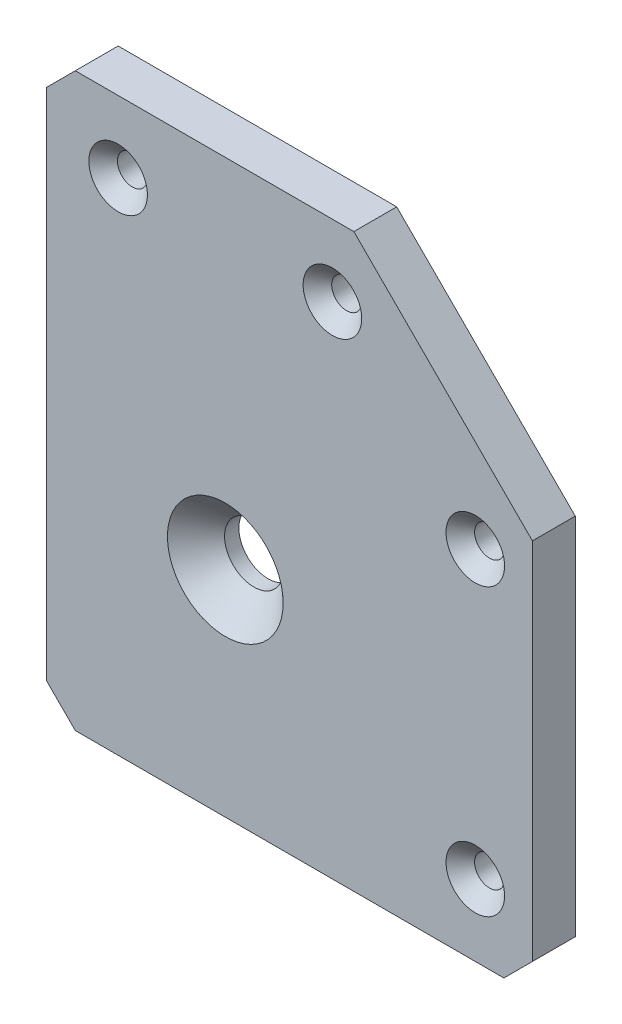
ISO-10303-21;
HEADER;
FILE_DESCRIPTION(('STEP AP214'),'2;1');
FILE_NAME('part.step','',(''),(''),'','','');
FILE_SCHEMA(('AUTOMOTIVE_DESIGN { 1 0 10303 214 1 1 1 1 }'));
ENDSEC;
DATA;
#1=APPLICATION_CONTEXT('core data for automotive mechanical design processes');
#2=APPLICATION_PROTOCOL_DEFINITION('international standard','automotive_design',2000,#1);
#3=PRODUCT_CONTEXT('',#1,'mechanical');
#4=PRODUCT('Part','Part','',(#3));
#5=PRODUCT_RELATED_PRODUCT_CATEGORY('part','',(#4));
#6=PRODUCT_DEFINITION_FORMATION('','',#4);
#7=PRODUCT_DEFINITION_CONTEXT('part definition',#1,'design');
#8=PRODUCT_DEFINITION('design','',#6,#7);
#9=PRODUCT_DEFINITION_SHAPE('','',#8);
#10=(LENGTH_UNIT() NAMED_UNIT(*) SI_UNIT(.MILLI.,.METRE.));
#11=(NAMED_UNIT(*) PLANE_ANGLE_UNIT() SI_UNIT($,.RADIAN.));
#12=(NAMED_UNIT(*) SI_UNIT($,.STERADIAN.) SOLID_ANGLE_UNIT());
#13=UNCERTAINTY_MEASURE_WITH_UNIT(LENGTH_MEASURE(1.E-05),#10,'distance_accuracy_value','');
#14=(GEOMETRIC_REPRESENTATION_CONTEXT(3) GLOBAL_UNCERTAINTY_ASSIGNED_CONTEXT((#13)) GLOBAL_UNIT_ASSIGNED_CONTEXT((#10,
#11,#12)) REPRESENTATION_CONTEXT('',''));
#15=CARTESIAN_POINT('',(0.,0.,0.));
#16=DIRECTION('',(0.,0.,1.));
#17=DIRECTION('',(1.,0.,0.));
#18=AXIS2_PLACEMENT_3D('',#15,#16,#17);
#19=CARTESIAN_POINT('',(0.,0.,3.));
#20=DIRECTION('',(0.,0.,1.));
#21=DIRECTION('',(1.,0.,0.));
#22=AXIS2_PLACEMENT_3D('',#19,#20,#21);
#23=PLANE('',#22);
#24=CARTESIAN_POINT('',(35.,-20.,3.));
#25=DIRECTION('',(0.,0.,1.));
#26=DIRECTION('',(1.,0.,0.));
#27=AXIS2_PLACEMENT_3D('',#24,#25,#26);
#28=CIRCLE('',#27,4.10000000000001);
#29=CARTESIAN_POINT('',(39.1,-20.,3.));
#30=VERTEX_POINT('',#29);
#31=EDGE_CURVE('E182',#30,#30,#28,.F.);
#32=ORIENTED_EDGE('',*,*,#31,.T.);
#33=EDGE_LOOP('',(#32));
#34=FACE_BOUND('',#33,.T.);
#35=CARTESIAN_POINT('',(35.,20.,3.));
#36=DIRECTION('',(0.,0.,1.));
#37=DIRECTION('',(1.,0.,0.));
#38=AXIS2_PLACEMENT_3D('',#35,#36,#37);
#39=CIRCLE('',#38,4.10000000000001);
#40=CARTESIAN_POINT('',(39.1,20.,3.));
#41=VERTEX_POINT('',#40);
#42=EDGE_CURVE('E179',#41,#41,#39,.F.);
#43=ORIENTED_EDGE('',*,*,#42,.T.);
#44=EDGE_LOOP('',(#43));
#45=FACE_BOUND('',#44,.T.);
#46=CARTESIAN_POINT('',(-15.,40.,3.));
#47=DIRECTION('',(0.,0.,1.));
#48=DIRECTION('',(1.,0.,0.));
#49=AXIS2_PLACEMENT_3D('',#46,#47,#48);
#50=CIRCLE('',#49,4.10000000000002);
#51=CARTESIAN_POINT('',(-10.9,40.,3.));
#52=VERTEX_POINT('',#51);
#53=EDGE_CURVE('E176',#52,#52,#50,.F.);
#54=ORIENTED_EDGE('',*,*,#53,.T.);
#55=EDGE_LOOP('',(#54));
#56=FACE_BOUND('',#55,.T.);
#57=CARTESIAN_POINT('',(15.,40.,3.));
#58=DIRECTION('',(0.,0.,1.));
#59=DIRECTION('',(1.,0.,0.));
#60=AXIS2_PLACEMENT_3D('',#57,#58,#59);
#61=CIRCLE('',#60,4.1);
#62=CARTESIAN_POINT('',(19.1,40.,3.));
#63=VERTEX_POINT('',#62);
#64=EDGE_CURVE('E173',#63,#63,#61,.F.);
#65=ORIENTED_EDGE('',*,*,#64,.T.);
#66=EDGE_LOOP('',(#65));
#67=FACE_BOUND('',#66,.T.);
#68=CARTESIAN_POINT('',(0.,0.,3.));
#69=DIRECTION('',(0.,0.,1.));
#70=DIRECTION('',(1.,0.,0.));
#71=AXIS2_PLACEMENT_3D('',#68,#69,#70);
#72=CIRCLE('',#71,8.1);
#73=CARTESIAN_POINT('',(8.1,0.,3.));
#74=VERTEX_POINT('',#73);
#75=EDGE_CURVE('E150',#74,#74,#72,.F.);
#76=ORIENTED_EDGE('',*,*,#75,.T.);
#77=EDGE_LOOP('',(#76));
#78=FACE_BOUND('',#77,.T.);
#79=DIRECTION('',(-1.,0.,0.));
#80=VECTOR('',#79,1.);
#81=CARTESIAN_POINT('',(43.,50.,3.));
#82=LINE('',#81,#80);
#83=CARTESIAN_POINT('',(18.,50.,3.));
#84=VERTEX_POINT('',#83);
#85=CARTESIAN_POINT('',(-21.,50.,3.));
#86=VERTEX_POINT('',#85);
#87=EDGE_CURVE('E122',#84,#86,#82,.T.);
#88=ORIENTED_EDGE('',*,*,#87,.T.);
#89=DIRECTION('',(0.707106781186547,0.707106781186548,0.));
#90=VECTOR('',#89,1.);
#91=CARTESIAN_POINT('',(-35.5,35.5,3.));
#92=LINE('',#91,#90);
#93=CARTESIAN_POINT('',(-25.,46.,3.));
#94=VERTEX_POINT('',#93);
#95=EDGE_CURVE('E148',#86,#94,#92,.F.);
#96=ORIENTED_EDGE('',*,*,#95,.T.);
#97=DIRECTION('',(0.,-1.,0.));
#98=VECTOR('',#97,1.);
#99=CARTESIAN_POINT('',(-25.,-30.,3.));
#100=LINE('',#99,#98);
#101=CARTESIAN_POINT('',(-25.,-26.,3.));
#102=VERTEX_POINT('',#101);
#103=EDGE_CURVE('E128',#94,#102,#100,.T.);
#104=ORIENTED_EDGE('',*,*,#103,.T.);
#105=DIRECTION('',(-0.707106781186546,0.707106781186549,0.));
#106=VECTOR('',#105,1.);
#107=CARTESIAN_POINT('',(-25.5000000000001,-25.5,3.));
#108=LINE('',#107,#106);
#109=CARTESIAN_POINT('',(-21.,-30.,3.));
#110=VERTEX_POINT('',#109);
#111=EDGE_CURVE('E144',#102,#110,#108,.F.);
#112=ORIENTED_EDGE('',*,*,#111,.T.);
#113=DIRECTION('',(1.,0.,0.));
#114=VECTOR('',#113,1.);
#115=CARTESIAN_POINT('',(43.,-30.,3.));
#116=LINE('',#115,#114);
#117=CARTESIAN_POINT('',(39.,-30.,3.));
#118=VERTEX_POINT('',#117);
#119=EDGE_CURVE('E132',#110,#118,#116,.T.);
#120=ORIENTED_EDGE('',*,*,#119,.T.);
#121=DIRECTION('',(-0.70710678118655,-0.707106781186545,0.));
#122=VECTOR('',#121,1.);
#123=CARTESIAN_POINT('',(34.4999999999999,-34.5000000000001,3.));
#124=LINE('',#123,#122);
#125=CARTESIAN_POINT('',(43.,-26.,3.));
#126=VERTEX_POINT('',#125);
#127=EDGE_CURVE('E146',#118,#126,#124,.F.);
#128=ORIENTED_EDGE('',*,*,#127,.T.);
#129=DIRECTION('',(0.,1.,0.));
#130=VECTOR('',#129,1.);
#131=CARTESIAN_POINT('',(43.,-30.,3.));
#132=LINE('',#131,#130);
#133=CARTESIAN_POINT('',(43.,24.9999999999999,3.));
#134=VERTEX_POINT('',#133);
#135=EDGE_CURVE('E309',#126,#134,#132,.T.);
#136=ORIENTED_EDGE('',*,*,#135,.T.);
#137=DIRECTION('',(0.707106781186547,-0.707106781186548,0.));
#138=VECTOR('',#137,1.);
#139=CARTESIAN_POINT('',(34.,33.9999999999999,3.));
#140=LINE('',#139,#138);
#141=EDGE_CURVE('E139',#134,#84,#140,.F.);
#142=ORIENTED_EDGE('',*,*,#141,.T.);
#143=EDGE_LOOP('',(#88,#96,#104,#112,#120,#128,#136,#142));
#144=FACE_BOUND('',#143,.T.);
#145=ADVANCED_FACE('F37',(#34,#45,#56,#67,#78,#144),#23,.T.);
#146=CARTESIAN_POINT('',(0.,0.,-3.));
#147=DIRECTION('',(0.,0.,1.));
#148=DIRECTION('',(1.,0.,0.));
#149=AXIS2_PLACEMENT_3D('',#146,#147,#148);
#150=PLANE('',#149);
#151=DIRECTION('',(0.,-1.,0.));
#152=VECTOR('',#151,1.);
#153=CARTESIAN_POINT('',(-25.,-30.,-3.));
#154=LINE('',#153,#152);
#155=CARTESIAN_POINT('',(-25.,46.,-3.));
#156=VERTEX_POINT('',#155);
#157=CARTESIAN_POINT('',(-25.,-26.,-3.));
#158=VERTEX_POINT('',#157);
#159=EDGE_CURVE('E305',#156,#158,#154,.T.);
#160=ORIENTED_EDGE('',*,*,#159,.F.);
#161=DIRECTION('',(-0.707106781186547,-0.707106781186548,0.));
#162=VECTOR('',#161,1.);
#163=CARTESIAN_POINT('',(-25.,46.,-3.));
#164=LINE('',#163,#162);
#165=CARTESIAN_POINT('',(-21.,50.,-3.));
#166=VERTEX_POINT('',#165);
#167=EDGE_CURVE('E127',#156,#166,#164,.F.);
#168=ORIENTED_EDGE('',*,*,#167,.T.);
#169=DIRECTION('',(-1.,0.,0.));
#170=VECTOR('',#169,1.);
#171=CARTESIAN_POINT('',(43.,50.,-3.));
#172=LINE('',#171,#170);
#173=CARTESIAN_POINT('',(18.,50.,-3.));
#174=VERTEX_POINT('',#173);
#175=EDGE_CURVE('E119',#174,#166,#172,.T.);
#176=ORIENTED_EDGE('',*,*,#175,.F.);
#177=DIRECTION('',(-0.707106781186547,0.707106781186548,0.));
#178=VECTOR('',#177,1.);
#179=CARTESIAN_POINT('',(18.,50.,-3.));
#180=LINE('',#179,#178);
#181=CARTESIAN_POINT('',(43.,24.9999999999999,-3.));
#182=VERTEX_POINT('',#181);
#183=EDGE_CURVE('E106',#174,#182,#180,.F.);
#184=ORIENTED_EDGE('',*,*,#183,.T.);
#185=DIRECTION('',(0.,1.,0.));
#186=VECTOR('',#185,1.);
#187=CARTESIAN_POINT('',(43.,-30.,-3.));
#188=LINE('',#187,#186);
#189=CARTESIAN_POINT('',(43.,-26.,-3.));
#190=VERTEX_POINT('',#189);
#191=EDGE_CURVE('E129',#190,#182,#188,.T.);
#192=ORIENTED_EDGE('',*,*,#191,.F.);
#193=DIRECTION('',(0.70710678118655,0.707106781186545,0.));
#194=VECTOR('',#193,1.);
#195=CARTESIAN_POINT('',(43.,-26.,-3.));
#196=LINE('',#195,#194);
#197=CARTESIAN_POINT('',(39.,-30.,-3.));
#198=VERTEX_POINT('',#197);
#199=EDGE_CURVE('E53',#190,#198,#196,.F.);
#200=ORIENTED_EDGE('',*,*,#199,.T.);
#201=DIRECTION('',(1.,0.,0.));
#202=VECTOR('',#201,1.);
#203=CARTESIAN_POINT('',(43.,-30.,-3.));
#204=LINE('',#203,#202);
#205=CARTESIAN_POINT('',(-21.,-30.,-3.));
#206=VERTEX_POINT('',#205);
#207=EDGE_CURVE('E134',#206,#198,#204,.T.);
#208=ORIENTED_EDGE('',*,*,#207,.F.);
#209=DIRECTION('',(0.707106781186546,-0.707106781186549,0.));
#210=VECTOR('',#209,1.);
#211=CARTESIAN_POINT('',(-21.,-30.,-3.));
#212=LINE('',#211,#210);
#213=EDGE_CURVE('E61',#206,#158,#212,.F.);
#214=ORIENTED_EDGE('',*,*,#213,.T.);
#215=EDGE_LOOP('',(#160,#168,#176,#184,#192,#200,#208,#214));
#216=FACE_BOUND('',#215,.T.);
#217=CARTESIAN_POINT('',(0.,0.,-3.));
#218=DIRECTION('',(0.,0.,1.));
#219=DIRECTION('',(1.,0.,0.));
#220=AXIS2_PLACEMENT_3D('',#217,#218,#219);
#221=CIRCLE('',#220,4.1);
#222=CARTESIAN_POINT('',(4.1,0.,-3.));
#223=VERTEX_POINT('',#222);
#224=EDGE_CURVE('E297',#223,#223,#221,.T.);
#225=ORIENTED_EDGE('',*,*,#224,.T.);
#226=EDGE_LOOP('',(#225));
#227=FACE_BOUND('',#226,.T.);
#228=CARTESIAN_POINT('',(35.,20.,-3.));
#229=DIRECTION('',(0.,0.,1.));
#230=DIRECTION('',(1.,0.,0.));
#231=AXIS2_PLACEMENT_3D('',#228,#229,#230);
#232=CIRCLE('',#231,2.1);
#233=CARTESIAN_POINT('',(37.1,20.,-3.));
#234=VERTEX_POINT('',#233);
#235=EDGE_CURVE('E293',#234,#234,#232,.T.);
#236=ORIENTED_EDGE('',*,*,#235,.T.);
#237=EDGE_LOOP('',(#236));
#238=FACE_BOUND('',#237,.T.);
#239=CARTESIAN_POINT('',(35.,-20.,-3.));
#240=DIRECTION('',(0.,0.,1.));
#241=DIRECTION('',(1.,0.,0.));
#242=AXIS2_PLACEMENT_3D('',#239,#240,#241);
#243=CIRCLE('',#242,2.1);
#244=CARTESIAN_POINT('',(37.1,-20.,-3.));
#245=VERTEX_POINT('',#244);
#246=EDGE_CURVE('E291',#245,#245,#243,.T.);
#247=ORIENTED_EDGE('',*,*,#246,.T.);
#248=EDGE_LOOP('',(#247));
#249=FACE_BOUND('',#248,.T.);
#250=CARTESIAN_POINT('',(-15.,40.,-3.));
#251=DIRECTION('',(0.,0.,1.));
#252=DIRECTION('',(1.,0.,0.));
#253=AXIS2_PLACEMENT_3D('',#250,#251,#252);
#254=CIRCLE('',#253,2.1);
#255=CARTESIAN_POINT('',(-12.9,40.,-3.));
#256=VERTEX_POINT('',#255);
#257=EDGE_CURVE('E294',#256,#256,#254,.T.);
#258=ORIENTED_EDGE('',*,*,#257,.T.);
#259=EDGE_LOOP('',(#258));
#260=FACE_BOUND('',#259,.T.);
#261=CARTESIAN_POINT('',(15.,40.,-3.));
#262=DIRECTION('',(0.,0.,1.));
#263=DIRECTION('',(1.,0.,0.));
#264=AXIS2_PLACEMENT_3D('',#261,#262,#263);
#265=CIRCLE('',#264,2.1);
#266=CARTESIAN_POINT('',(17.1,40.,-3.));
#267=VERTEX_POINT('',#266);
#268=EDGE_CURVE('E300',#267,#267,#265,.T.);
#269=ORIENTED_EDGE('',*,*,#268,.T.);
#270=EDGE_LOOP('',(#269));
#271=FACE_BOUND('',#270,.T.);
#272=ADVANCED_FACE('F125',(#216,#227,#238,#249,#260,#271),#150,.F.);
#273=CARTESIAN_POINT('',(-25.,-30.,3.));
#274=DIRECTION('',(1.,0.,0.));
#275=DIRECTION('',(0.,1.,0.));
#276=AXIS2_PLACEMENT_3D('',#273,#274,#275);
#277=PLANE('',#276);
#278=ORIENTED_EDGE('',*,*,#103,.F.);
#279=DIRECTION('',(0.,0.,-1.));
#280=VECTOR('',#279,1.);
#281=CARTESIAN_POINT('',(-25.,46.,3.));
#282=LINE('',#281,#280);
#283=EDGE_CURVE('E155',#94,#156,#282,.T.);
#284=ORIENTED_EDGE('',*,*,#283,.T.);
#285=ORIENTED_EDGE('',*,*,#159,.T.);
#286=DIRECTION('',(0.,0.,1.));
#287=VECTOR('',#286,1.);
#288=CARTESIAN_POINT('',(-25.,-26.,3.));
#289=LINE('',#288,#287);
#290=EDGE_CURVE('E153',#158,#102,#289,.T.);
#291=ORIENTED_EDGE('',*,*,#290,.T.);
#292=EDGE_LOOP('',(#278,#284,#285,#291));
#293=FACE_BOUND('',#292,.T.);
#294=ADVANCED_FACE('F213',(#293),#277,.F.);
#295=CARTESIAN_POINT('',(43.,-30.,3.));
#296=DIRECTION('',(0.,1.,0.));
#297=DIRECTION('',(-1.,0.,0.));
#298=AXIS2_PLACEMENT_3D('',#295,#296,#297);
#299=PLANE('',#298);
#300=ORIENTED_EDGE('',*,*,#207,.T.);
#301=DIRECTION('',(0.,0.,1.));
#302=VECTOR('',#301,1.);
#303=CARTESIAN_POINT('',(39.,-30.,3.));
#304=LINE('',#303,#302);
#305=EDGE_CURVE('E168',#198,#118,#304,.T.);
#306=ORIENTED_EDGE('',*,*,#305,.T.);
#307=ORIENTED_EDGE('',*,*,#119,.F.);
#308=DIRECTION('',(0.,0.,-1.));
#309=VECTOR('',#308,1.);
#310=CARTESIAN_POINT('',(-21.,-30.,3.));
#311=LINE('',#310,#309);
#312=EDGE_CURVE('E166',#110,#206,#311,.T.);
#313=ORIENTED_EDGE('',*,*,#312,.T.);
#314=EDGE_LOOP('',(#300,#306,#307,#313));
#315=FACE_BOUND('',#314,.T.);
#316=ADVANCED_FACE('F225',(#315),#299,.F.);
#317=CARTESIAN_POINT('',(43.,-30.,3.));
#318=DIRECTION('',(-1.,0.,0.));
#319=DIRECTION('',(0.,-1.,0.));
#320=AXIS2_PLACEMENT_3D('',#317,#318,#319);
#321=PLANE('',#320);
#322=ORIENTED_EDGE('',*,*,#135,.F.);
#323=DIRECTION('',(0.,0.,-1.));
#324=VECTOR('',#323,1.);
#325=CARTESIAN_POINT('',(43.,-26.,3.));
#326=LINE('',#325,#324);
#327=EDGE_CURVE('E163',#126,#190,#326,.T.);
#328=ORIENTED_EDGE('',*,*,#327,.T.);
#329=ORIENTED_EDGE('',*,*,#191,.T.);
#330=DIRECTION('',(0.,0.,1.));
#331=VECTOR('',#330,1.);
#332=CARTESIAN_POINT('',(43.,24.9999999999999,3.));
#333=LINE('',#332,#331);
#334=EDGE_CURVE('E112',#182,#134,#333,.T.);
#335=ORIENTED_EDGE('',*,*,#334,.T.);
#336=EDGE_LOOP('',(#322,#328,#329,#335));
#337=FACE_BOUND('',#336,.T.);
#338=ADVANCED_FACE('F222',(#337),#321,.F.);
#339=CARTESIAN_POINT('',(43.,50.,3.));
#340=DIRECTION('',(0.,-1.,0.));
#341=DIRECTION('',(1.,0.,0.));
#342=AXIS2_PLACEMENT_3D('',#339,#340,#341);
#343=PLANE('',#342);
#344=ORIENTED_EDGE('',*,*,#175,.T.);
#345=DIRECTION('',(0.,0.,1.));
#346=VECTOR('',#345,1.);
#347=CARTESIAN_POINT('',(-21.,50.,3.));
#348=LINE('',#347,#346);
#349=EDGE_CURVE('E161',#166,#86,#348,.T.);
#350=ORIENTED_EDGE('',*,*,#349,.T.);
#351=ORIENTED_EDGE('',*,*,#87,.F.);
#352=DIRECTION('',(0.,0.,-1.));
#353=VECTOR('',#352,1.);
#354=CARTESIAN_POINT('',(18.,50.,3.));
#355=LINE('',#354,#353);
#356=EDGE_CURVE('E110',#84,#174,#355,.T.);
#357=ORIENTED_EDGE('',*,*,#356,.T.);
#358=EDGE_LOOP('',(#344,#350,#351,#357));
#359=FACE_BOUND('',#358,.T.);
#360=ADVANCED_FACE('F118',(#359),#343,.F.);
#361=CARTESIAN_POINT('',(0.,0.,3.));
#362=DIRECTION('',(0.,0.,-1.));
#363=DIRECTION('',(-1.,0.,0.));
#364=AXIS2_PLACEMENT_3D('',#361,#362,#363);
#365=CYLINDRICAL_SURFACE('',#364,4.1);
#366=CARTESIAN_POINT('',(0.,0.,-0.999999999999997));
#367=DIRECTION('',(0.,0.,1.));
#368=DIRECTION('',(1.,0.,0.));
#369=AXIS2_PLACEMENT_3D('',#366,#367,#368);
#370=CIRCLE('',#369,4.1);
#371=CARTESIAN_POINT('',(4.1,0.,-0.999999999999997));
#372=VERTEX_POINT('',#371);
#373=EDGE_CURVE('E141',#372,#372,#370,.T.);
#374=ORIENTED_EDGE('',*,*,#373,.T.);
#375=EDGE_LOOP('',(#374));
#376=FACE_BOUND('',#375,.T.);
#377=ORIENTED_EDGE('',*,*,#224,.F.);
#378=EDGE_LOOP('',(#377));
#379=FACE_BOUND('',#378,.T.);
#380=ADVANCED_FACE('F217',(#376,#379),#365,.F.);
#381=CARTESIAN_POINT('',(35.,20.,3.));
#382=DIRECTION('',(0.,0.,-1.));
#383=DIRECTION('',(-1.,0.,0.));
#384=AXIS2_PLACEMENT_3D('',#381,#382,#383);
#385=CYLINDRICAL_SURFACE('',#384,2.1);
#386=CARTESIAN_POINT('',(35.,20.,0.999999999999998));
#387=DIRECTION('',(0.,0.,1.));
#388=DIRECTION('',(1.,0.,0.));
#389=AXIS2_PLACEMENT_3D('',#386,#387,#388);
#390=CIRCLE('',#389,2.1);
#391=CARTESIAN_POINT('',(37.1,20.,0.999999999999998));
#392=VERTEX_POINT('',#391);
#393=EDGE_CURVE('E185',#392,#392,#390,.T.);
#394=ORIENTED_EDGE('',*,*,#393,.T.);
#395=EDGE_LOOP('',(#394));
#396=FACE_BOUND('',#395,.T.);
#397=ORIENTED_EDGE('',*,*,#235,.F.);
#398=EDGE_LOOP('',(#397));
#399=FACE_BOUND('',#398,.T.);
#400=ADVANCED_FACE('F287',(#396,#399),#385,.F.);
#401=CARTESIAN_POINT('',(35.,-20.,3.));
#402=DIRECTION('',(0.,0.,-1.));
#403=DIRECTION('',(-1.,0.,0.));
#404=AXIS2_PLACEMENT_3D('',#401,#402,#403);
#405=CYLINDRICAL_SURFACE('',#404,2.1);
#406=CARTESIAN_POINT('',(35.,-20.,0.999999999999998));
#407=DIRECTION('',(0.,0.,1.));
#408=DIRECTION('',(1.,0.,0.));
#409=AXIS2_PLACEMENT_3D('',#406,#407,#408);
#410=CIRCLE('',#409,2.1);
#411=CARTESIAN_POINT('',(37.1,-20.,0.999999999999998));
#412=VERTEX_POINT('',#411);
#413=EDGE_CURVE('E170',#412,#412,#410,.T.);
#414=ORIENTED_EDGE('',*,*,#413,.T.);
#415=EDGE_LOOP('',(#414));
#416=FACE_BOUND('',#415,.T.);
#417=ORIENTED_EDGE('',*,*,#246,.F.);
#418=EDGE_LOOP('',(#417));
#419=FACE_BOUND('',#418,.T.);
#420=ADVANCED_FACE('F284',(#416,#419),#405,.F.);
#421=CARTESIAN_POINT('',(-15.,40.,3.));
#422=DIRECTION('',(0.,0.,-1.));
#423=DIRECTION('',(-1.,0.,0.));
#424=AXIS2_PLACEMENT_3D('',#421,#422,#423);
#425=CYLINDRICAL_SURFACE('',#424,2.1);
#426=CARTESIAN_POINT('',(-15.,40.,0.999999999999969));
#427=DIRECTION('',(0.,0.,1.));
#428=DIRECTION('',(1.,0.,0.));
#429=AXIS2_PLACEMENT_3D('',#426,#427,#428);
#430=CIRCLE('',#429,2.1);
#431=CARTESIAN_POINT('',(-12.9,40.,0.999999999999969));
#432=VERTEX_POINT('',#431);
#433=EDGE_CURVE('E46',#432,#432,#430,.T.);
#434=ORIENTED_EDGE('',*,*,#433,.T.);
#435=EDGE_LOOP('',(#434));
#436=FACE_BOUND('',#435,.T.);
#437=ORIENTED_EDGE('',*,*,#257,.F.);
#438=EDGE_LOOP('',(#437));
#439=FACE_BOUND('',#438,.T.);
#440=ADVANCED_FACE('F190',(#436,#439),#425,.F.);
#441=CARTESIAN_POINT('',(15.,40.,3.));
#442=DIRECTION('',(0.,0.,-1.));
#443=DIRECTION('',(-1.,0.,0.));
#444=AXIS2_PLACEMENT_3D('',#441,#442,#443);
#445=CYLINDRICAL_SURFACE('',#444,2.1);
#446=CARTESIAN_POINT('',(15.,40.,0.999999999999998));
#447=DIRECTION('',(0.,0.,1.));
#448=DIRECTION('',(1.,0.,0.));
#449=AXIS2_PLACEMENT_3D('',#446,#447,#448);
#450=CIRCLE('',#449,2.1);
#451=CARTESIAN_POINT('',(17.1,40.,0.999999999999998));
#452=VERTEX_POINT('',#451);
#453=EDGE_CURVE('E11',#452,#452,#450,.T.);
#454=ORIENTED_EDGE('',*,*,#453,.T.);
#455=EDGE_LOOP('',(#454));
#456=FACE_BOUND('',#455,.T.);
#457=ORIENTED_EDGE('',*,*,#268,.F.);
#458=EDGE_LOOP('',(#457));
#459=FACE_BOUND('',#458,.T.);
#460=ADVANCED_FACE('F240',(#456,#459),#445,.F.);
#461=CARTESIAN_POINT('',(18.,50.,3.));
#462=DIRECTION('',(-0.707106781186548,-0.707106781186547,0.));
#463=DIRECTION('',(0.,0.,-1.));
#464=AXIS2_PLACEMENT_3D('',#461,#462,#463);
#465=PLANE('',#464);
#466=ORIENTED_EDGE('',*,*,#141,.F.);
#467=ORIENTED_EDGE('',*,*,#334,.F.);
#468=ORIENTED_EDGE('',*,*,#183,.F.);
#469=ORIENTED_EDGE('',*,*,#356,.F.);
#470=EDGE_LOOP('',(#466,#467,#468,#469));
#471=FACE_BOUND('',#470,.T.);
#472=ADVANCED_FACE('F109',(#471),#465,.F.);
#473=CARTESIAN_POINT('',(0.,0.,-0.999999999999997));
#474=DIRECTION('',(0.,0.,1.));
#475=DIRECTION('',(1.,0.,0.));
#476=AXIS2_PLACEMENT_3D('',#473,#474,#475);
#477=CONICAL_SURFACE('',#476,4.1,0.785398163397448);
#478=ORIENTED_EDGE('',*,*,#75,.F.);
#479=EDGE_LOOP('',(#478));
#480=FACE_BOUND('',#479,.T.);
#481=ORIENTED_EDGE('',*,*,#373,.F.);
#482=EDGE_LOOP('',(#481));
#483=FACE_BOUND('',#482,.T.);
#484=ADVANCED_FACE('F239',(#480,#483),#477,.F.);
#485=CARTESIAN_POINT('',(-25.,46.,3.));
#486=DIRECTION('',(0.707106781186548,-0.707106781186547,0.));
#487=DIRECTION('',(0.,0.,-1.));
#488=AXIS2_PLACEMENT_3D('',#485,#486,#487);
#489=PLANE('',#488);
#490=ORIENTED_EDGE('',*,*,#95,.F.);
#491=ORIENTED_EDGE('',*,*,#349,.F.);
#492=ORIENTED_EDGE('',*,*,#167,.F.);
#493=ORIENTED_EDGE('',*,*,#283,.F.);
#494=EDGE_LOOP('',(#490,#491,#492,#493));
#495=FACE_BOUND('',#494,.T.);
#496=ADVANCED_FACE('F246',(#495),#489,.F.);
#497=CARTESIAN_POINT('',(43.,-26.,3.));
#498=DIRECTION('',(-0.707106781186545,0.70710678118655,0.));
#499=DIRECTION('',(0.,0.,-1.));
#500=AXIS2_PLACEMENT_3D('',#497,#498,#499);
#501=PLANE('',#500);
#502=ORIENTED_EDGE('',*,*,#127,.F.);
#503=ORIENTED_EDGE('',*,*,#305,.F.);
#504=ORIENTED_EDGE('',*,*,#199,.F.);
#505=ORIENTED_EDGE('',*,*,#327,.F.);
#506=EDGE_LOOP('',(#502,#503,#504,#505));
#507=FACE_BOUND('',#506,.T.);
#508=ADVANCED_FACE('F253',(#507),#501,.F.);
#509=CARTESIAN_POINT('',(-21.,-30.,3.));
#510=DIRECTION('',(0.707106781186549,0.707106781186546,0.));
#511=DIRECTION('',(0.,0.,-1.));
#512=AXIS2_PLACEMENT_3D('',#509,#510,#511);
#513=PLANE('',#512);
#514=ORIENTED_EDGE('',*,*,#111,.F.);
#515=ORIENTED_EDGE('',*,*,#290,.F.);
#516=ORIENTED_EDGE('',*,*,#213,.F.);
#517=ORIENTED_EDGE('',*,*,#312,.F.);
#518=EDGE_LOOP('',(#514,#515,#516,#517));
#519=FACE_BOUND('',#518,.T.);
#520=ADVANCED_FACE('F260',(#519),#513,.F.);
#521=CARTESIAN_POINT('',(35.,-20.,0.999999999999998));
#522=DIRECTION('',(0.,0.,1.));
#523=DIRECTION('',(1.,0.,0.));
#524=AXIS2_PLACEMENT_3D('',#521,#522,#523);
#525=CONICAL_SURFACE('',#524,2.1,0.78539816339745);
#526=ORIENTED_EDGE('',*,*,#31,.F.);
#527=EDGE_LOOP('',(#526));
#528=FACE_BOUND('',#527,.T.);
#529=ORIENTED_EDGE('',*,*,#413,.F.);
#530=EDGE_LOOP('',(#529));
#531=FACE_BOUND('',#530,.T.);
#532=ADVANCED_FACE('F202',(#528,#531),#525,.F.);
#533=CARTESIAN_POINT('',(35.,20.,0.999999999999998));
#534=DIRECTION('',(0.,0.,1.));
#535=DIRECTION('',(1.,0.,0.));
#536=AXIS2_PLACEMENT_3D('',#533,#534,#535);
#537=CONICAL_SURFACE('',#536,2.1,0.78539816339745);
#538=ORIENTED_EDGE('',*,*,#42,.F.);
#539=EDGE_LOOP('',(#538));
#540=FACE_BOUND('',#539,.T.);
#541=ORIENTED_EDGE('',*,*,#393,.F.);
#542=EDGE_LOOP('',(#541));
#543=FACE_BOUND('',#542,.T.);
#544=ADVANCED_FACE('F195',(#540,#543),#537,.F.);
#545=CARTESIAN_POINT('',(-15.,40.,0.999999999999969));
#546=DIRECTION('',(0.,0.,1.));
#547=DIRECTION('',(1.,0.,0.));
#548=AXIS2_PLACEMENT_3D('',#545,#546,#547);
#549=CONICAL_SURFACE('',#548,2.1,0.785398163397446);
#550=ORIENTED_EDGE('',*,*,#53,.F.);
#551=EDGE_LOOP('',(#550));
#552=FACE_BOUND('',#551,.T.);
#553=ORIENTED_EDGE('',*,*,#433,.F.);
#554=EDGE_LOOP('',(#553));
#555=FACE_BOUND('',#554,.T.);
#556=ADVANCED_FACE('F193',(#552,#555),#549,.F.);
#557=CARTESIAN_POINT('',(15.,40.,0.999999999999998));
#558=DIRECTION('',(0.,0.,1.));
#559=DIRECTION('',(1.,0.,0.));
#560=AXIS2_PLACEMENT_3D('',#557,#558,#559);
#561=CONICAL_SURFACE('',#560,2.1,0.78539816339745);
#562=ORIENTED_EDGE('',*,*,#64,.F.);
#563=EDGE_LOOP('',(#562));
#564=FACE_BOUND('',#563,.T.);
#565=ORIENTED_EDGE('',*,*,#453,.F.);
#566=EDGE_LOOP('',(#565));
#567=FACE_BOUND('',#566,.T.);
#568=ADVANCED_FACE('F40',(#564,#567),#561,.F.);
#569=CLOSED_SHELL('',(#145,#272,#294,#316,#338,#360,#380,#400,#420,#440,#460,#472,#484,#496,
#508,#520,#532,#544,#556,#568));
#570=MANIFOLD_SOLID_BREP('B2',#569);
#571=ADVANCED_BREP_SHAPE_REPRESENTATION('',(#18,#570),#14);
#572=SHAPE_DEFINITION_REPRESENTATION(#9,#571);
ENDSEC;
END-ISO-10303-21;
